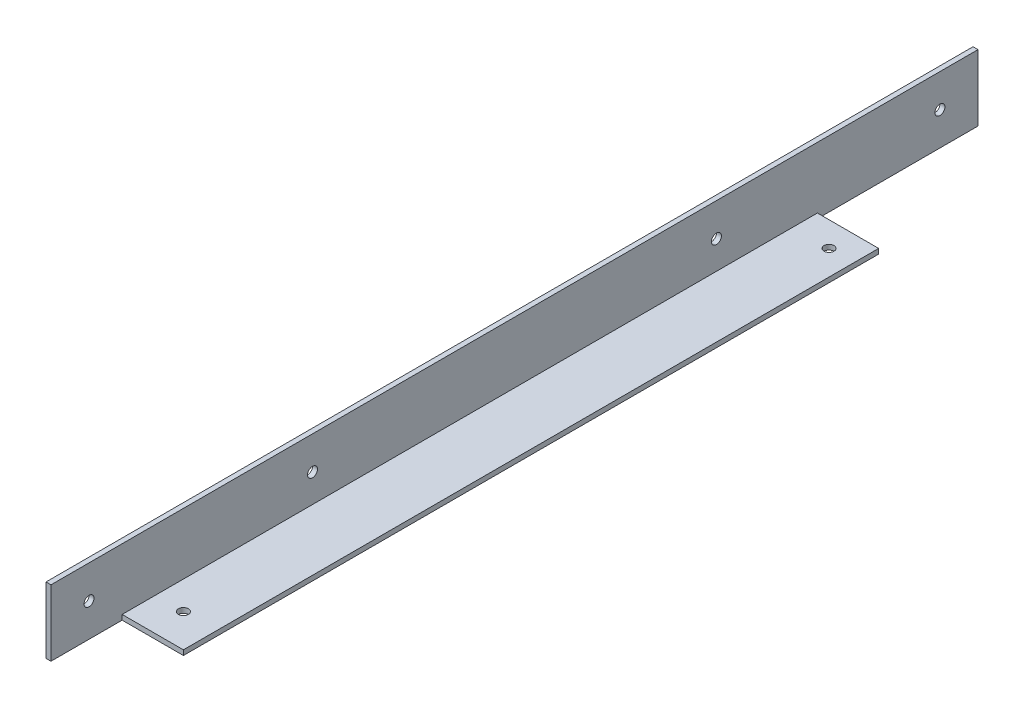
ISO-10303-21;
HEADER;
FILE_DESCRIPTION(('STEP AP214'),'2;1');
FILE_NAME('part.step','',(''),(''),'','','');
FILE_SCHEMA(('AUTOMOTIVE_DESIGN { 1 0 10303 214 1 1 1 1 }'));
ENDSEC;
DATA;
#1=APPLICATION_CONTEXT('core data for automotive mechanical design processes');
#2=APPLICATION_PROTOCOL_DEFINITION('international standard','automotive_design',2000,#1);
#3=PRODUCT_CONTEXT('',#1,'mechanical');
#4=PRODUCT('Part','Part','',(#3));
#5=PRODUCT_RELATED_PRODUCT_CATEGORY('part','',(#4));
#6=PRODUCT_DEFINITION_FORMATION('','',#4);
#7=PRODUCT_DEFINITION_CONTEXT('part definition',#1,'design');
#8=PRODUCT_DEFINITION('design','',#6,#7);
#9=PRODUCT_DEFINITION_SHAPE('','',#8);
#10=(LENGTH_UNIT() NAMED_UNIT(*) SI_UNIT(.MILLI.,.METRE.));
#11=(NAMED_UNIT(*) PLANE_ANGLE_UNIT() SI_UNIT($,.RADIAN.));
#12=(NAMED_UNIT(*) SI_UNIT($,.STERADIAN.) SOLID_ANGLE_UNIT());
#13=UNCERTAINTY_MEASURE_WITH_UNIT(LENGTH_MEASURE(1.E-05),#10,'distance_accuracy_value','');
#14=(GEOMETRIC_REPRESENTATION_CONTEXT(3) GLOBAL_UNCERTAINTY_ASSIGNED_CONTEXT((#13)) GLOBAL_UNIT_ASSIGNED_CONTEXT((#10,
#11,#12)) REPRESENTATION_CONTEXT('',''));
#15=CARTESIAN_POINT('',(0.,0.,0.));
#16=DIRECTION('',(0.,0.,1.));
#17=DIRECTION('',(1.,0.,0.));
#18=AXIS2_PLACEMENT_3D('',#15,#16,#17);
#19=CARTESIAN_POINT('',(0.,20.,280.));
#20=DIRECTION('',(1.,0.,0.));
#21=DIRECTION('',(0.,1.,0.));
#22=AXIS2_PLACEMENT_3D('',#19,#20,#21);
#23=PLANE('',#22);
#24=CARTESIAN_POINT('',(0.,9.99999999999999,201.));
#25=DIRECTION('',(-1.,0.,0.));
#26=DIRECTION('',(0.,-1.,0.));
#27=AXIS2_PLACEMENT_3D('',#24,#25,#26);
#28=CIRCLE('',#27,1.5);
#29=CARTESIAN_POINT('',(0.,8.49999999999999,201.));
#30=VERTEX_POINT('',#29);
#31=EDGE_CURVE('E156',#30,#30,#28,.T.);
#32=ORIENTED_EDGE('',*,*,#31,.F.);
#33=EDGE_LOOP('',(#32));
#34=FACE_BOUND('',#33,.T.);
#35=CARTESIAN_POINT('',(0.,9.99999999999998,79.));
#36=DIRECTION('',(-1.,0.,0.));
#37=DIRECTION('',(0.,-1.,0.));
#38=AXIS2_PLACEMENT_3D('',#35,#36,#37);
#39=CIRCLE('',#38,1.5);
#40=CARTESIAN_POINT('',(0.,8.49999999999998,79.));
#41=VERTEX_POINT('',#40);
#42=EDGE_CURVE('E146',#41,#41,#39,.T.);
#43=ORIENTED_EDGE('',*,*,#42,.F.);
#44=EDGE_LOOP('',(#43));
#45=FACE_BOUND('',#44,.T.);
#46=CARTESIAN_POINT('',(0.,9.99999999999997,11.5));
#47=DIRECTION('',(-1.,0.,0.));
#48=DIRECTION('',(0.,-1.,0.));
#49=AXIS2_PLACEMENT_3D('',#46,#47,#48);
#50=CIRCLE('',#49,1.5);
#51=CARTESIAN_POINT('',(0.,8.49999999999997,11.5));
#52=VERTEX_POINT('',#51);
#53=EDGE_CURVE('E143',#52,#52,#50,.T.);
#54=ORIENTED_EDGE('',*,*,#53,.F.);
#55=EDGE_LOOP('',(#54));
#56=FACE_BOUND('',#55,.T.);
#57=CARTESIAN_POINT('',(0.,10.,268.5));
#58=DIRECTION('',(-1.,0.,0.));
#59=DIRECTION('',(0.,-1.,0.));
#60=AXIS2_PLACEMENT_3D('',#57,#58,#59);
#61=CIRCLE('',#60,1.50000000000002);
#62=CARTESIAN_POINT('',(0.,8.49999999999998,268.5));
#63=VERTEX_POINT('',#62);
#64=EDGE_CURVE('E140',#63,#63,#61,.T.);
#65=ORIENTED_EDGE('',*,*,#64,.F.);
#66=EDGE_LOOP('',(#65));
#67=FACE_BOUND('',#66,.T.);
#68=DIRECTION('',(0.,-1.,0.));
#69=VECTOR('',#68,1.);
#70=CARTESIAN_POINT('',(0.,20.,0.));
#71=LINE('',#70,#69);
#72=CARTESIAN_POINT('',(0.,20.,0.));
#73=VERTEX_POINT('',#72);
#74=CARTESIAN_POINT('',(0.,0.,0.));
#75=VERTEX_POINT('',#74);
#76=EDGE_CURVE('E171',#73,#75,#71,.T.);
#77=ORIENTED_EDGE('',*,*,#76,.T.);
#78=DIRECTION('',(0.,0.,-1.));
#79=VECTOR('',#78,1.);
#80=CARTESIAN_POINT('',(0.,0.,280.));
#81=LINE('',#80,#79);
#82=CARTESIAN_POINT('',(0.,0.,280.));
#83=VERTEX_POINT('',#82);
#84=EDGE_CURVE('E11',#83,#75,#81,.T.);
#85=ORIENTED_EDGE('',*,*,#84,.F.);
#86=DIRECTION('',(0.,-1.,0.));
#87=VECTOR('',#86,1.);
#88=CARTESIAN_POINT('',(0.,20.,280.));
#89=LINE('',#88,#87);
#90=CARTESIAN_POINT('',(0.,20.,280.));
#91=VERTEX_POINT('',#90);
#92=EDGE_CURVE('E174',#91,#83,#89,.T.);
#93=ORIENTED_EDGE('',*,*,#92,.F.);
#94=DIRECTION('',(0.,0.,-1.));
#95=VECTOR('',#94,1.);
#96=CARTESIAN_POINT('',(0.,20.,280.));
#97=LINE('',#96,#95);
#98=EDGE_CURVE('E131',#91,#73,#97,.T.);
#99=ORIENTED_EDGE('',*,*,#98,.T.);
#100=EDGE_LOOP('',(#77,#85,#93,#99));
#101=FACE_BOUND('',#100,.T.);
#102=ADVANCED_FACE('F30',(#34,#45,#56,#67,#101),#23,.F.);
#103=CARTESIAN_POINT('',(0.,0.,280.));
#104=DIRECTION('',(0.,1.,0.));
#105=DIRECTION('',(0.,0.,1.));
#106=AXIS2_PLACEMENT_3D('',#103,#104,#105);
#107=PLANE('',#106);
#108=CARTESIAN_POINT('',(10.,0.,248.5));
#109=DIRECTION('',(0.,1.,0.));
#110=DIRECTION('',(-1.,0.,0.));
#111=AXIS2_PLACEMENT_3D('',#108,#109,#110);
#112=CIRCLE('',#111,1.5);
#113=CARTESIAN_POINT('',(8.5,0.,248.5));
#114=VERTEX_POINT('',#113);
#115=EDGE_CURVE('E162',#114,#114,#112,.T.);
#116=ORIENTED_EDGE('',*,*,#115,.T.);
#117=EDGE_LOOP('',(#116));
#118=FACE_BOUND('',#117,.T.);
#119=CARTESIAN_POINT('',(12.5,0.,56.));
#120=DIRECTION('',(0.,1.,0.));
#121=DIRECTION('',(-1.,0.,0.));
#122=AXIS2_PLACEMENT_3D('',#119,#120,#121);
#123=CIRCLE('',#122,1.5);
#124=CARTESIAN_POINT('',(11.,0.,56.));
#125=VERTEX_POINT('',#124);
#126=EDGE_CURVE('E168',#125,#125,#123,.T.);
#127=ORIENTED_EDGE('',*,*,#126,.T.);
#128=EDGE_LOOP('',(#127));
#129=FACE_BOUND('',#128,.T.);
#130=DIRECTION('',(0.,0.,-1.));
#131=VECTOR('',#130,1.);
#132=CARTESIAN_POINT('',(20.,0.,280.));
#133=LINE('',#132,#131);
#134=CARTESIAN_POINT('',(20.,0.,258.5));
#135=VERTEX_POINT('',#134);
#136=CARTESIAN_POINT('',(20.,0.,48.5));
#137=VERTEX_POINT('',#136);
#138=EDGE_CURVE('E38',#135,#137,#133,.T.);
#139=ORIENTED_EDGE('',*,*,#138,.F.);
#140=DIRECTION('',(1.,0.,0.));
#141=VECTOR('',#140,1.);
#142=CARTESIAN_POINT('',(20.,0.,258.5));
#143=LINE('',#142,#141);
#144=CARTESIAN_POINT('',(1.5,0.,258.5));
#145=VERTEX_POINT('',#144);
#146=EDGE_CURVE('E121',#145,#135,#143,.T.);
#147=ORIENTED_EDGE('',*,*,#146,.F.);
#148=DIRECTION('',(0.,0.,-1.));
#149=VECTOR('',#148,1.);
#150=CARTESIAN_POINT('',(1.5,0.,280.));
#151=LINE('',#150,#149);
#152=CARTESIAN_POINT('',(1.5,0.,280.));
#153=VERTEX_POINT('',#152);
#154=EDGE_CURVE('E110',#153,#145,#151,.T.);
#155=ORIENTED_EDGE('',*,*,#154,.F.);
#156=DIRECTION('',(1.,0.,0.));
#157=VECTOR('',#156,1.);
#158=CARTESIAN_POINT('',(0.,0.,280.));
#159=LINE('',#158,#157);
#160=EDGE_CURVE('E75',#83,#153,#159,.T.);
#161=ORIENTED_EDGE('',*,*,#160,.F.);
#162=ORIENTED_EDGE('',*,*,#84,.T.);
#163=DIRECTION('',(1.,0.,0.));
#164=VECTOR('',#163,1.);
#165=CARTESIAN_POINT('',(0.,0.,0.));
#166=LINE('',#165,#164);
#167=CARTESIAN_POINT('',(1.5,0.,0.));
#168=VERTEX_POINT('',#167);
#169=EDGE_CURVE('E182',#75,#168,#166,.T.);
#170=ORIENTED_EDGE('',*,*,#169,.T.);
#171=DIRECTION('',(0.,0.,-1.));
#172=VECTOR('',#171,1.);
#173=CARTESIAN_POINT('',(1.5,0.,0.));
#174=LINE('',#173,#172);
#175=CARTESIAN_POINT('',(1.5,0.,48.5));
#176=VERTEX_POINT('',#175);
#177=EDGE_CURVE('E355',#176,#168,#174,.T.);
#178=ORIENTED_EDGE('',*,*,#177,.F.);
#179=DIRECTION('',(-1.,0.,0.));
#180=VECTOR('',#179,1.);
#181=CARTESIAN_POINT('',(20.,0.,48.5));
#182=LINE('',#181,#180);
#183=EDGE_CURVE('E351',#137,#176,#182,.T.);
#184=ORIENTED_EDGE('',*,*,#183,.F.);
#185=EDGE_LOOP('',(#139,#147,#155,#161,#162,#170,#178,#184));
#186=FACE_BOUND('',#185,.T.);
#187=ADVANCED_FACE('F193',(#118,#129,#186),#107,.F.);
#188=CARTESIAN_POINT('',(20.,0.,280.));
#189=DIRECTION('',(-1.,0.,0.));
#190=DIRECTION('',(0.,0.,1.));
#191=AXIS2_PLACEMENT_3D('',#188,#189,#190);
#192=PLANE('',#191);
#193=DIRECTION('',(0.,0.,-1.));
#194=VECTOR('',#193,1.);
#195=CARTESIAN_POINT('',(20.,1.5,280.));
#196=LINE('',#195,#194);
#197=CARTESIAN_POINT('',(20.,1.5,258.5));
#198=VERTEX_POINT('',#197);
#199=CARTESIAN_POINT('',(20.,1.5,48.5));
#200=VERTEX_POINT('',#199);
#201=EDGE_CURVE('E127',#198,#200,#196,.T.);
#202=ORIENTED_EDGE('',*,*,#201,.F.);
#203=DIRECTION('',(0.,-1.,0.));
#204=VECTOR('',#203,1.);
#205=CARTESIAN_POINT('',(20.,1.5,258.5));
#206=LINE('',#205,#204);
#207=EDGE_CURVE('E113',#198,#135,#206,.T.);
#208=ORIENTED_EDGE('',*,*,#207,.T.);
#209=ORIENTED_EDGE('',*,*,#138,.T.);
#210=DIRECTION('',(0.,-1.,0.));
#211=VECTOR('',#210,1.);
#212=CARTESIAN_POINT('',(20.,1.5,48.5));
#213=LINE('',#212,#211);
#214=EDGE_CURVE('E354',#200,#137,#213,.T.);
#215=ORIENTED_EDGE('',*,*,#214,.F.);
#216=EDGE_LOOP('',(#202,#208,#209,#215));
#217=FACE_BOUND('',#216,.T.);
#218=ADVANCED_FACE('F196',(#217),#192,.F.);
#219=CARTESIAN_POINT('',(20.,1.5,280.));
#220=DIRECTION('',(0.,-1.,0.));
#221=DIRECTION('',(1.,0.,0.));
#222=AXIS2_PLACEMENT_3D('',#219,#220,#221);
#223=PLANE('',#222);
#224=CARTESIAN_POINT('',(10.,1.5,248.5));
#225=DIRECTION('',(0.,1.,0.));
#226=DIRECTION('',(-1.,0.,0.));
#227=AXIS2_PLACEMENT_3D('',#224,#225,#226);
#228=CIRCLE('',#227,1.5);
#229=CARTESIAN_POINT('',(8.5,1.5,248.5));
#230=VERTEX_POINT('',#229);
#231=EDGE_CURVE('E139',#230,#230,#228,.T.);
#232=ORIENTED_EDGE('',*,*,#231,.F.);
#233=EDGE_LOOP('',(#232));
#234=FACE_BOUND('',#233,.T.);
#235=CARTESIAN_POINT('',(12.5,1.5,56.));
#236=DIRECTION('',(0.,1.,0.));
#237=DIRECTION('',(-1.,0.,0.));
#238=AXIS2_PLACEMENT_3D('',#235,#236,#237);
#239=CIRCLE('',#238,1.5);
#240=CARTESIAN_POINT('',(11.,1.5,56.));
#241=VERTEX_POINT('',#240);
#242=EDGE_CURVE('E165',#241,#241,#239,.T.);
#243=ORIENTED_EDGE('',*,*,#242,.F.);
#244=EDGE_LOOP('',(#243));
#245=FACE_BOUND('',#244,.T.);
#246=DIRECTION('',(0.,0.,-1.));
#247=VECTOR('',#246,1.);
#248=CARTESIAN_POINT('',(1.5,1.5,280.));
#249=LINE('',#248,#247);
#250=CARTESIAN_POINT('',(1.5,1.5,258.5));
#251=VERTEX_POINT('',#250);
#252=CARTESIAN_POINT('',(1.5,1.5,48.5));
#253=VERTEX_POINT('',#252);
#254=EDGE_CURVE('E108',#251,#253,#249,.T.);
#255=ORIENTED_EDGE('',*,*,#254,.F.);
#256=DIRECTION('',(1.,0.,0.));
#257=VECTOR('',#256,1.);
#258=CARTESIAN_POINT('',(20.,1.5,258.5));
#259=LINE('',#258,#257);
#260=EDGE_CURVE('E114',#251,#198,#259,.T.);
#261=ORIENTED_EDGE('',*,*,#260,.T.);
#262=ORIENTED_EDGE('',*,*,#201,.T.);
#263=DIRECTION('',(-1.,0.,0.));
#264=VECTOR('',#263,1.);
#265=CARTESIAN_POINT('',(20.,1.5,48.5));
#266=LINE('',#265,#264);
#267=EDGE_CURVE('E126',#200,#253,#266,.T.);
#268=ORIENTED_EDGE('',*,*,#267,.T.);
#269=EDGE_LOOP('',(#255,#261,#262,#268));
#270=FACE_BOUND('',#269,.T.);
#271=ADVANCED_FACE('F124',(#234,#245,#270),#223,.F.);
#272=CARTESIAN_POINT('',(1.5,1.5,280.));
#273=DIRECTION('',(-1.,0.,0.));
#274=DIRECTION('',(0.,-1.,0.));
#275=AXIS2_PLACEMENT_3D('',#272,#273,#274);
#276=PLANE('',#275);
#277=CARTESIAN_POINT('',(1.5,9.99999999999999,201.));
#278=DIRECTION('',(-1.,0.,0.));
#279=DIRECTION('',(0.,-1.,0.));
#280=AXIS2_PLACEMENT_3D('',#277,#278,#279);
#281=CIRCLE('',#280,1.5);
#282=CARTESIAN_POINT('',(1.5,8.49999999999999,201.));
#283=VERTEX_POINT('',#282);
#284=EDGE_CURVE('E33',#283,#283,#281,.T.);
#285=ORIENTED_EDGE('',*,*,#284,.T.);
#286=EDGE_LOOP('',(#285));
#287=FACE_BOUND('',#286,.T.);
#288=CARTESIAN_POINT('',(1.5,9.99999999999998,79.));
#289=DIRECTION('',(-1.,0.,0.));
#290=DIRECTION('',(0.,-1.,0.));
#291=AXIS2_PLACEMENT_3D('',#288,#289,#290);
#292=CIRCLE('',#291,1.5);
#293=CARTESIAN_POINT('',(1.5,8.49999999999998,79.));
#294=VERTEX_POINT('',#293);
#295=EDGE_CURVE('E144',#294,#294,#292,.T.);
#296=ORIENTED_EDGE('',*,*,#295,.T.);
#297=EDGE_LOOP('',(#296));
#298=FACE_BOUND('',#297,.T.);
#299=CARTESIAN_POINT('',(1.5,9.99999999999997,11.5));
#300=DIRECTION('',(-1.,0.,0.));
#301=DIRECTION('',(0.,-1.,0.));
#302=AXIS2_PLACEMENT_3D('',#299,#300,#301);
#303=CIRCLE('',#302,1.5);
#304=CARTESIAN_POINT('',(1.5,8.49999999999997,11.5));
#305=VERTEX_POINT('',#304);
#306=EDGE_CURVE('E141',#305,#305,#303,.T.);
#307=ORIENTED_EDGE('',*,*,#306,.T.);
#308=EDGE_LOOP('',(#307));
#309=FACE_BOUND('',#308,.T.);
#310=CARTESIAN_POINT('',(1.5,10.,268.5));
#311=DIRECTION('',(-1.,0.,0.));
#312=DIRECTION('',(0.,-1.,0.));
#313=AXIS2_PLACEMENT_3D('',#310,#311,#312);
#314=CIRCLE('',#313,1.50000000000002);
#315=CARTESIAN_POINT('',(1.5,8.49999999999998,268.5));
#316=VERTEX_POINT('',#315);
#317=EDGE_CURVE('E136',#316,#316,#314,.T.);
#318=ORIENTED_EDGE('',*,*,#317,.T.);
#319=EDGE_LOOP('',(#318));
#320=FACE_BOUND('',#319,.T.);
#321=DIRECTION('',(0.,1.,0.));
#322=VECTOR('',#321,1.);
#323=CARTESIAN_POINT('',(1.5,1.5,0.));
#324=LINE('',#323,#322);
#325=CARTESIAN_POINT('',(1.5,20.,0.));
#326=VERTEX_POINT('',#325);
#327=EDGE_CURVE('E46',#168,#326,#324,.T.);
#328=ORIENTED_EDGE('',*,*,#327,.T.);
#329=DIRECTION('',(0.,0.,-1.));
#330=VECTOR('',#329,1.);
#331=CARTESIAN_POINT('',(1.5,20.,280.));
#332=LINE('',#331,#330);
#333=CARTESIAN_POINT('',(1.5,20.,280.));
#334=VERTEX_POINT('',#333);
#335=EDGE_CURVE('E128',#334,#326,#332,.T.);
#336=ORIENTED_EDGE('',*,*,#335,.F.);
#337=DIRECTION('',(0.,1.,0.));
#338=VECTOR('',#337,1.);
#339=CARTESIAN_POINT('',(1.5,1.5,280.));
#340=LINE('',#339,#338);
#341=EDGE_CURVE('E177',#153,#334,#340,.T.);
#342=ORIENTED_EDGE('',*,*,#341,.F.);
#343=ORIENTED_EDGE('',*,*,#154,.T.);
#344=DIRECTION('',(0.,-1.,0.));
#345=VECTOR('',#344,1.);
#346=CARTESIAN_POINT('',(1.5,1.5,258.5));
#347=LINE('',#346,#345);
#348=EDGE_CURVE('E104',#251,#145,#347,.T.);
#349=ORIENTED_EDGE('',*,*,#348,.F.);
#350=ORIENTED_EDGE('',*,*,#254,.T.);
#351=DIRECTION('',(0.,-1.,0.));
#352=VECTOR('',#351,1.);
#353=CARTESIAN_POINT('',(1.5,1.5,48.5));
#354=LINE('',#353,#352);
#355=EDGE_CURVE('E352',#253,#176,#354,.T.);
#356=ORIENTED_EDGE('',*,*,#355,.T.);
#357=ORIENTED_EDGE('',*,*,#177,.T.);
#358=EDGE_LOOP('',(#328,#336,#342,#343,#349,#350,#356,#357));
#359=FACE_BOUND('',#358,.T.);
#360=ADVANCED_FACE('F106',(#287,#298,#309,#320,#359),#276,.F.);
#361=CARTESIAN_POINT('',(1.5,20.,280.));
#362=DIRECTION('',(0.,-1.,0.));
#363=DIRECTION('',(0.,0.,-1.));
#364=AXIS2_PLACEMENT_3D('',#361,#362,#363);
#365=PLANE('',#364);
#366=DIRECTION('',(-1.,0.,0.));
#367=VECTOR('',#366,1.);
#368=CARTESIAN_POINT('',(1.5,20.,0.));
#369=LINE('',#368,#367);
#370=EDGE_CURVE('E69',#326,#73,#369,.T.);
#371=ORIENTED_EDGE('',*,*,#370,.T.);
#372=ORIENTED_EDGE('',*,*,#98,.F.);
#373=DIRECTION('',(-1.,0.,0.));
#374=VECTOR('',#373,1.);
#375=CARTESIAN_POINT('',(1.5,20.,280.));
#376=LINE('',#375,#374);
#377=EDGE_CURVE('E55',#334,#91,#376,.T.);
#378=ORIENTED_EDGE('',*,*,#377,.F.);
#379=ORIENTED_EDGE('',*,*,#335,.T.);
#380=EDGE_LOOP('',(#371,#372,#378,#379));
#381=FACE_BOUND('',#380,.T.);
#382=ADVANCED_FACE('F212',(#381),#365,.F.);
#383=CARTESIAN_POINT('',(0.,0.,280.));
#384=DIRECTION('',(0.,0.,1.));
#385=DIRECTION('',(1.,0.,0.));
#386=AXIS2_PLACEMENT_3D('',#383,#384,#385);
#387=PLANE('',#386);
#388=ORIENTED_EDGE('',*,*,#160,.T.);
#389=ORIENTED_EDGE('',*,*,#341,.T.);
#390=ORIENTED_EDGE('',*,*,#377,.T.);
#391=ORIENTED_EDGE('',*,*,#92,.T.);
#392=EDGE_LOOP('',(#388,#389,#390,#391));
#393=FACE_BOUND('',#392,.T.);
#394=ADVANCED_FACE('F216',(#393),#387,.T.);
#395=CARTESIAN_POINT('',(0.,0.,0.));
#396=DIRECTION('',(0.,0.,1.));
#397=DIRECTION('',(1.,0.,0.));
#398=AXIS2_PLACEMENT_3D('',#395,#396,#397);
#399=PLANE('',#398);
#400=ORIENTED_EDGE('',*,*,#327,.F.);
#401=ORIENTED_EDGE('',*,*,#169,.F.);
#402=ORIENTED_EDGE('',*,*,#76,.F.);
#403=ORIENTED_EDGE('',*,*,#370,.F.);
#404=EDGE_LOOP('',(#400,#401,#402,#403));
#405=FACE_BOUND('',#404,.T.);
#406=ADVANCED_FACE('F190',(#405),#399,.F.);
#407=CARTESIAN_POINT('',(12.5,0.,56.));
#408=DIRECTION('',(0.,1.,0.));
#409=DIRECTION('',(-1.,0.,0.));
#410=AXIS2_PLACEMENT_3D('',#407,#408,#409);
#411=CYLINDRICAL_SURFACE('',#410,1.5);
#412=ORIENTED_EDGE('',*,*,#126,.F.);
#413=EDGE_LOOP('',(#412));
#414=FACE_BOUND('',#413,.T.);
#415=ORIENTED_EDGE('',*,*,#242,.T.);
#416=EDGE_LOOP('',(#415));
#417=FACE_BOUND('',#416,.T.);
#418=ADVANCED_FACE('F219',(#414,#417),#411,.F.);
#419=CARTESIAN_POINT('',(10.,0.,248.5));
#420=DIRECTION('',(0.,1.,0.));
#421=DIRECTION('',(-1.,0.,0.));
#422=AXIS2_PLACEMENT_3D('',#419,#420,#421);
#423=CYLINDRICAL_SURFACE('',#422,1.5);
#424=ORIENTED_EDGE('',*,*,#115,.F.);
#425=EDGE_LOOP('',(#424));
#426=FACE_BOUND('',#425,.T.);
#427=ORIENTED_EDGE('',*,*,#231,.T.);
#428=EDGE_LOOP('',(#427));
#429=FACE_BOUND('',#428,.T.);
#430=ADVANCED_FACE('F224',(#426,#429),#423,.F.);
#431=CARTESIAN_POINT('',(10.,10.,268.5));
#432=DIRECTION('',(-1.,0.,0.));
#433=DIRECTION('',(0.,-1.,0.));
#434=AXIS2_PLACEMENT_3D('',#431,#432,#433);
#435=CYLINDRICAL_SURFACE('',#434,1.50000000000002);
#436=ORIENTED_EDGE('',*,*,#64,.T.);
#437=EDGE_LOOP('',(#436));
#438=FACE_BOUND('',#437,.T.);
#439=ORIENTED_EDGE('',*,*,#317,.F.);
#440=EDGE_LOOP('',(#439));
#441=FACE_BOUND('',#440,.T.);
#442=ADVANCED_FACE('F228',(#438,#441),#435,.F.);
#443=CARTESIAN_POINT('',(10.,9.99999999999997,11.5));
#444=DIRECTION('',(-1.,0.,0.));
#445=DIRECTION('',(0.,-1.,0.));
#446=AXIS2_PLACEMENT_3D('',#443,#444,#445);
#447=CYLINDRICAL_SURFACE('',#446,1.5);
#448=ORIENTED_EDGE('',*,*,#53,.T.);
#449=EDGE_LOOP('',(#448));
#450=FACE_BOUND('',#449,.T.);
#451=ORIENTED_EDGE('',*,*,#306,.F.);
#452=EDGE_LOOP('',(#451));
#453=FACE_BOUND('',#452,.T.);
#454=ADVANCED_FACE('F232',(#450,#453),#447,.F.);
#455=CARTESIAN_POINT('',(10.,9.99999999999998,79.));
#456=DIRECTION('',(-1.,0.,0.));
#457=DIRECTION('',(0.,-1.,0.));
#458=AXIS2_PLACEMENT_3D('',#455,#456,#457);
#459=CYLINDRICAL_SURFACE('',#458,1.5);
#460=ORIENTED_EDGE('',*,*,#42,.T.);
#461=EDGE_LOOP('',(#460));
#462=FACE_BOUND('',#461,.T.);
#463=ORIENTED_EDGE('',*,*,#295,.F.);
#464=EDGE_LOOP('',(#463));
#465=FACE_BOUND('',#464,.T.);
#466=ADVANCED_FACE('F236',(#462,#465),#459,.F.);
#467=CARTESIAN_POINT('',(10.,9.99999999999999,201.));
#468=DIRECTION('',(-1.,0.,0.));
#469=DIRECTION('',(0.,-1.,0.));
#470=AXIS2_PLACEMENT_3D('',#467,#468,#469);
#471=CYLINDRICAL_SURFACE('',#470,1.5);
#472=ORIENTED_EDGE('',*,*,#31,.T.);
#473=EDGE_LOOP('',(#472));
#474=FACE_BOUND('',#473,.T.);
#475=ORIENTED_EDGE('',*,*,#284,.F.);
#476=EDGE_LOOP('',(#475));
#477=FACE_BOUND('',#476,.T.);
#478=ADVANCED_FACE('F240',(#474,#477),#471,.F.);
#479=CARTESIAN_POINT('',(20.,1.5,48.5));
#480=DIRECTION('',(0.,0.,1.));
#481=DIRECTION('',(1.,0.,0.));
#482=AXIS2_PLACEMENT_3D('',#479,#480,#481);
#483=PLANE('',#482);
#484=ORIENTED_EDGE('',*,*,#183,.T.);
#485=ORIENTED_EDGE('',*,*,#355,.F.);
#486=ORIENTED_EDGE('',*,*,#267,.F.);
#487=ORIENTED_EDGE('',*,*,#214,.T.);
#488=EDGE_LOOP('',(#484,#485,#486,#487));
#489=FACE_BOUND('',#488,.T.);
#490=ADVANCED_FACE('F243',(#489),#483,.F.);
#491=CARTESIAN_POINT('',(20.,1.5,258.5));
#492=DIRECTION('',(0.,0.,-1.));
#493=DIRECTION('',(-1.,0.,0.));
#494=AXIS2_PLACEMENT_3D('',#491,#492,#493);
#495=PLANE('',#494);
#496=ORIENTED_EDGE('',*,*,#146,.T.);
#497=ORIENTED_EDGE('',*,*,#207,.F.);
#498=ORIENTED_EDGE('',*,*,#260,.F.);
#499=ORIENTED_EDGE('',*,*,#348,.T.);
#500=EDGE_LOOP('',(#496,#497,#498,#499));
#501=FACE_BOUND('',#500,.T.);
#502=ADVANCED_FACE('F117',(#501),#495,.F.);
#503=CLOSED_SHELL('',(#102,#187,#218,#271,#360,#382,#394,#406,#418,#430,#442,#454,#466,#478,
#490,#502));
#504=MANIFOLD_SOLID_BREP('B2',#503);
#505=ADVANCED_BREP_SHAPE_REPRESENTATION('',(#18,#504),#14);
#506=SHAPE_DEFINITION_REPRESENTATION(#9,#505);
ENDSEC;
END-ISO-10303-21;
